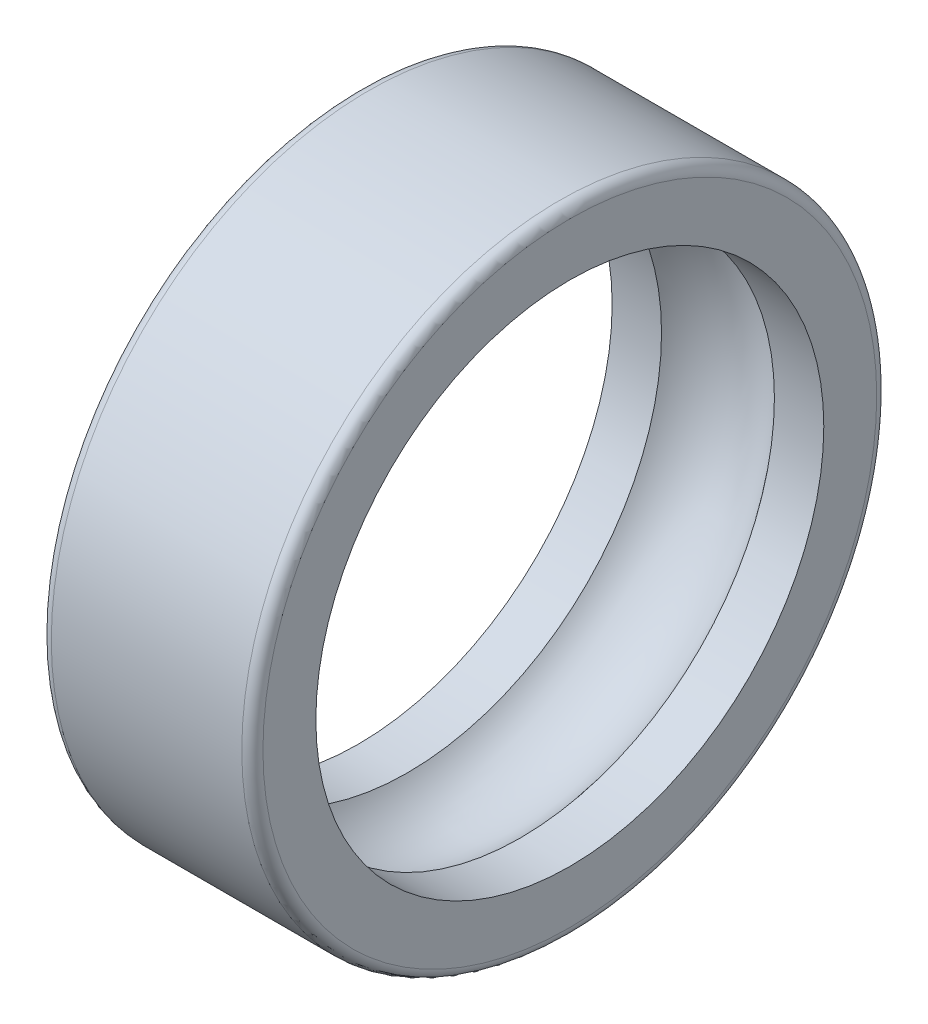
ISO-10303-21;
HEADER;
FILE_DESCRIPTION(('STEP AP214'),'2;1');
FILE_NAME('part.step','',(''),(''),'','','');
FILE_SCHEMA(('AUTOMOTIVE_DESIGN { 1 0 10303 214 1 1 1 1 }'));
ENDSEC;
DATA;
#1=APPLICATION_CONTEXT('core data for automotive mechanical design processes');
#2=APPLICATION_PROTOCOL_DEFINITION('international standard','automotive_design',2000,#1);
#3=PRODUCT_CONTEXT('',#1,'mechanical');
#4=PRODUCT('Part','Part','',(#3));
#5=PRODUCT_RELATED_PRODUCT_CATEGORY('part','',(#4));
#6=PRODUCT_DEFINITION_FORMATION('','',#4);
#7=PRODUCT_DEFINITION_CONTEXT('part definition',#1,'design');
#8=PRODUCT_DEFINITION('design','',#6,#7);
#9=PRODUCT_DEFINITION_SHAPE('','',#8);
#10=(LENGTH_UNIT() NAMED_UNIT(*) SI_UNIT(.MILLI.,.METRE.));
#11=(NAMED_UNIT(*) PLANE_ANGLE_UNIT() SI_UNIT($,.RADIAN.));
#12=(NAMED_UNIT(*) SI_UNIT($,.STERADIAN.) SOLID_ANGLE_UNIT());
#13=UNCERTAINTY_MEASURE_WITH_UNIT(LENGTH_MEASURE(1.E-05),#10,'distance_accuracy_value','');
#14=(GEOMETRIC_REPRESENTATION_CONTEXT(3) GLOBAL_UNCERTAINTY_ASSIGNED_CONTEXT((#13)) GLOBAL_UNIT_ASSIGNED_CONTEXT((#10,
#11,#12)) REPRESENTATION_CONTEXT('',''));
#15=CARTESIAN_POINT('',(0.,0.,0.));
#16=DIRECTION('',(0.,0.,1.));
#17=DIRECTION('',(1.,0.,0.));
#18=AXIS2_PLACEMENT_3D('',#15,#16,#17);
#19=CARTESIAN_POINT('',(0.,5.8,0.));
#20=DIRECTION('',(1.,0.,0.));
#21=DIRECTION('',(0.,0.,-1.));
#22=AXIS2_PLACEMENT_3D('',#19,#20,#21);
#23=PLANE('',#22);
#24=CARTESIAN_POINT('',(0.,0.,0.));
#25=DIRECTION('',(-1.,0.,0.));
#26=DIRECTION('',(0.,0.,1.));
#27=AXIS2_PLACEMENT_3D('',#24,#25,#26);
#28=CIRCLE('',#27,4.8);
#29=CARTESIAN_POINT('',(0.,0.,4.8));
#30=VERTEX_POINT('',#29);
#31=EDGE_CURVE('E10',#30,#30,#28,.T.);
#32=ORIENTED_EDGE('',*,*,#31,.F.);
#33=EDGE_LOOP('',(#32));
#34=FACE_BOUND('',#33,.T.);
#35=CARTESIAN_POINT('',(0.,0.,0.));
#36=DIRECTION('',(-1.,0.,0.));
#37=DIRECTION('',(0.,0.,1.));
#38=AXIS2_PLACEMENT_3D('',#35,#36,#37);
#39=CIRCLE('',#38,5.8);
#40=CARTESIAN_POINT('',(0.,0.,5.8));
#41=VERTEX_POINT('',#40);
#42=EDGE_CURVE('E56',#41,#41,#39,.T.);
#43=ORIENTED_EDGE('',*,*,#42,.T.);
#44=EDGE_LOOP('',(#43));
#45=FACE_BOUND('',#44,.T.);
#46=ADVANCED_FACE('F14',(#34,#45),#23,.F.);
#47=CARTESIAN_POINT('',(0.,0.,0.));
#48=DIRECTION('',(-1.,0.,0.));
#49=DIRECTION('',(0.,0.,1.));
#50=AXIS2_PLACEMENT_3D('',#47,#48,#49);
#51=CYLINDRICAL_SURFACE('',#50,4.8);
#52=CARTESIAN_POINT('',(0.933333333333333,0.,0.));
#53=DIRECTION('',(-1.,0.,0.));
#54=DIRECTION('',(0.,0.,1.));
#55=AXIS2_PLACEMENT_3D('',#52,#53,#54);
#56=CIRCLE('',#55,4.8);
#57=CARTESIAN_POINT('',(0.933333333333333,0.,4.8));
#58=VERTEX_POINT('',#57);
#59=EDGE_CURVE('E21',#58,#58,#56,.T.);
#60=ORIENTED_EDGE('',*,*,#59,.F.);
#61=EDGE_LOOP('',(#60));
#62=FACE_BOUND('',#61,.T.);
#63=ORIENTED_EDGE('',*,*,#31,.T.);
#64=EDGE_LOOP('',(#63));
#65=FACE_BOUND('',#64,.T.);
#66=ADVANCED_FACE('F94',(#62,#65),#51,.F.);
#67=CARTESIAN_POINT('',(2.,0.,0.));
#68=DIRECTION('',(-1.,0.,0.));
#69=DIRECTION('',(0.,0.,1.));
#70=AXIS2_PLACEMENT_3D('',#67,#68,#69);
#71=TOROIDAL_SURFACE('',#70,4.,1.33333333333333);
#72=ORIENTED_EDGE('',*,*,#59,.T.);
#73=EDGE_LOOP('',(#72));
#74=FACE_BOUND('',#73,.T.);
#75=CARTESIAN_POINT('',(3.06666666666667,0.,0.));
#76=DIRECTION('',(-1.,0.,0.));
#77=DIRECTION('',(0.,0.,1.));
#78=AXIS2_PLACEMENT_3D('',#75,#76,#77);
#79=CIRCLE('',#78,4.8);
#80=CARTESIAN_POINT('',(3.06666666666667,0.,4.8));
#81=VERTEX_POINT('',#80);
#82=EDGE_CURVE('E30',#81,#81,#79,.T.);
#83=ORIENTED_EDGE('',*,*,#82,.F.);
#84=EDGE_LOOP('',(#83));
#85=FACE_BOUND('',#84,.T.);
#86=ADVANCED_FACE('F89',(#74,#85),#71,.F.);
#87=CARTESIAN_POINT('',(0.,0.,0.));
#88=DIRECTION('',(-1.,0.,0.));
#89=DIRECTION('',(0.,0.,1.));
#90=AXIS2_PLACEMENT_3D('',#87,#88,#89);
#91=CYLINDRICAL_SURFACE('',#90,4.8);
#92=CARTESIAN_POINT('',(4.,0.,0.));
#93=DIRECTION('',(-1.,0.,0.));
#94=DIRECTION('',(0.,0.,1.));
#95=AXIS2_PLACEMENT_3D('',#92,#93,#94);
#96=CIRCLE('',#95,4.8);
#97=CARTESIAN_POINT('',(4.,0.,4.8));
#98=VERTEX_POINT('',#97);
#99=EDGE_CURVE('E38',#98,#98,#96,.T.);
#100=ORIENTED_EDGE('',*,*,#99,.F.);
#101=EDGE_LOOP('',(#100));
#102=FACE_BOUND('',#101,.T.);
#103=ORIENTED_EDGE('',*,*,#82,.T.);
#104=EDGE_LOOP('',(#103));
#105=FACE_BOUND('',#104,.T.);
#106=ADVANCED_FACE('F83',(#102,#105),#91,.F.);
#107=CARTESIAN_POINT('',(4.,4.8,0.));
#108=DIRECTION('',(-1.,0.,0.));
#109=DIRECTION('',(0.,0.,1.));
#110=AXIS2_PLACEMENT_3D('',#107,#108,#109);
#111=PLANE('',#110);
#112=CARTESIAN_POINT('',(4.,0.,0.));
#113=DIRECTION('',(-1.,0.,0.));
#114=DIRECTION('',(0.,0.,1.));
#115=AXIS2_PLACEMENT_3D('',#112,#113,#114);
#116=CIRCLE('',#115,5.8);
#117=CARTESIAN_POINT('',(4.,0.,5.8));
#118=VERTEX_POINT('',#117);
#119=EDGE_CURVE('E44',#118,#118,#116,.T.);
#120=ORIENTED_EDGE('',*,*,#119,.F.);
#121=EDGE_LOOP('',(#120));
#122=FACE_BOUND('',#121,.T.);
#123=ORIENTED_EDGE('',*,*,#99,.T.);
#124=EDGE_LOOP('',(#123));
#125=FACE_BOUND('',#124,.T.);
#126=ADVANCED_FACE('F77',(#122,#125),#111,.F.);
#127=CARTESIAN_POINT('',(3.8,0.,0.));
#128=DIRECTION('',(-1.,0.,0.));
#129=DIRECTION('',(0.,0.,1.));
#130=AXIS2_PLACEMENT_3D('',#127,#128,#129);
#131=TOROIDAL_SURFACE('',#130,5.8,0.2);
#132=CARTESIAN_POINT('',(3.8,0.,0.));
#133=DIRECTION('',(-1.,0.,0.));
#134=DIRECTION('',(0.,0.,1.));
#135=AXIS2_PLACEMENT_3D('',#132,#133,#134);
#136=CIRCLE('',#135,6.);
#137=CARTESIAN_POINT('',(3.8,0.,6.));
#138=VERTEX_POINT('',#137);
#139=EDGE_CURVE('E48',#138,#138,#136,.T.);
#140=ORIENTED_EDGE('',*,*,#139,.F.);
#141=EDGE_LOOP('',(#140));
#142=FACE_BOUND('',#141,.T.);
#143=ORIENTED_EDGE('',*,*,#119,.T.);
#144=EDGE_LOOP('',(#143));
#145=FACE_BOUND('',#144,.T.);
#146=ADVANCED_FACE('F71',(#142,#145),#131,.T.);
#147=CARTESIAN_POINT('',(0.,0.,0.));
#148=DIRECTION('',(-1.,0.,0.));
#149=DIRECTION('',(0.,0.,1.));
#150=AXIS2_PLACEMENT_3D('',#147,#148,#149);
#151=CYLINDRICAL_SURFACE('',#150,6.);
#152=CARTESIAN_POINT('',(0.2,0.,0.));
#153=DIRECTION('',(-1.,0.,0.));
#154=DIRECTION('',(0.,0.,1.));
#155=AXIS2_PLACEMENT_3D('',#152,#153,#154);
#156=CIRCLE('',#155,6.);
#157=CARTESIAN_POINT('',(0.2,0.,6.));
#158=VERTEX_POINT('',#157);
#159=EDGE_CURVE('E52',#158,#158,#156,.T.);
#160=ORIENTED_EDGE('',*,*,#159,.F.);
#161=EDGE_LOOP('',(#160));
#162=FACE_BOUND('',#161,.T.);
#163=ORIENTED_EDGE('',*,*,#139,.T.);
#164=EDGE_LOOP('',(#163));
#165=FACE_BOUND('',#164,.T.);
#166=ADVANCED_FACE('F65',(#162,#165),#151,.T.);
#167=CARTESIAN_POINT('',(0.2,0.,0.));
#168=DIRECTION('',(-1.,0.,0.));
#169=DIRECTION('',(0.,0.,1.));
#170=AXIS2_PLACEMENT_3D('',#167,#168,#169);
#171=TOROIDAL_SURFACE('',#170,5.8,0.2);
#172=ORIENTED_EDGE('',*,*,#42,.F.);
#173=EDGE_LOOP('',(#172));
#174=FACE_BOUND('',#173,.T.);
#175=ORIENTED_EDGE('',*,*,#159,.T.);
#176=EDGE_LOOP('',(#175));
#177=FACE_BOUND('',#176,.T.);
#178=ADVANCED_FACE('F62',(#174,#177),#171,.T.);
#179=CLOSED_SHELL('',(#46,#66,#86,#106,#126,#146,#166,#178));
#180=MANIFOLD_SOLID_BREP('B1',#179);
#181=ADVANCED_BREP_SHAPE_REPRESENTATION('',(#18,#180),#14);
#182=SHAPE_DEFINITION_REPRESENTATION(#9,#181);
ENDSEC;
END-ISO-10303-21;
